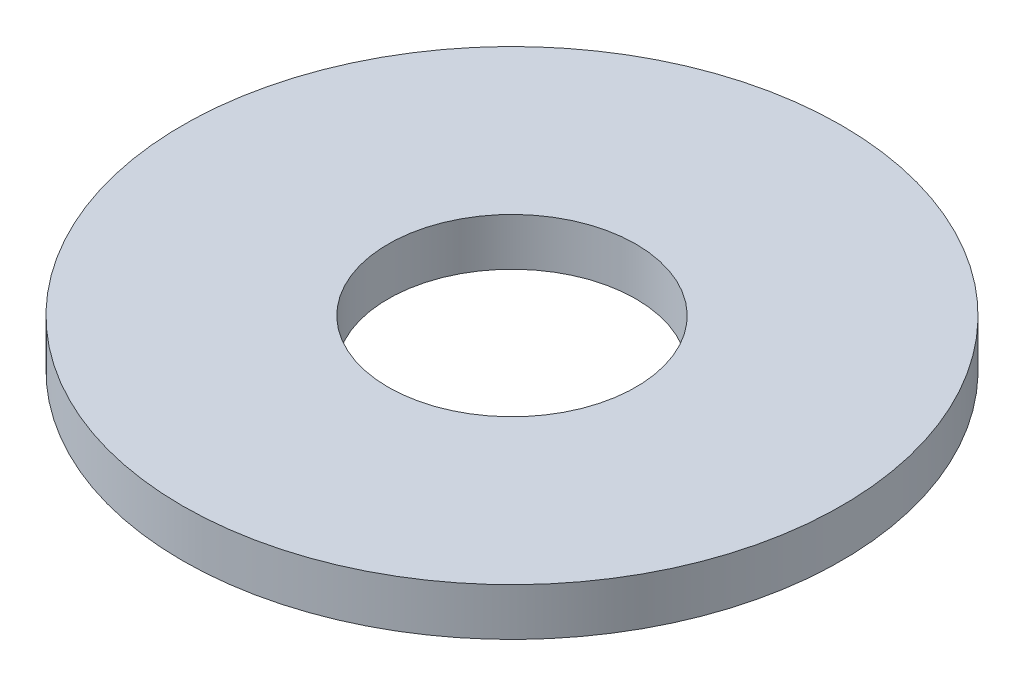
ISO-10303-21;
HEADER;
FILE_DESCRIPTION(('STEP AP214'),'2;1');
FILE_NAME('part.step','',(''),(''),'','','');
FILE_SCHEMA(('AUTOMOTIVE_DESIGN { 1 0 10303 214 1 1 1 1 }'));
ENDSEC;
DATA;
#1=APPLICATION_CONTEXT('core data for automotive mechanical design processes');
#2=APPLICATION_PROTOCOL_DEFINITION('international standard','automotive_design',2000,#1);
#3=PRODUCT_CONTEXT('',#1,'mechanical');
#4=PRODUCT('Part','Part','',(#3));
#5=PRODUCT_RELATED_PRODUCT_CATEGORY('part','',(#4));
#6=PRODUCT_DEFINITION_FORMATION('','',#4);
#7=PRODUCT_DEFINITION_CONTEXT('part definition',#1,'design');
#8=PRODUCT_DEFINITION('design','',#6,#7);
#9=PRODUCT_DEFINITION_SHAPE('','',#8);
#10=(LENGTH_UNIT() NAMED_UNIT(*) SI_UNIT(.MILLI.,.METRE.));
#11=(NAMED_UNIT(*) PLANE_ANGLE_UNIT() SI_UNIT($,.RADIAN.));
#12=(NAMED_UNIT(*) SI_UNIT($,.STERADIAN.) SOLID_ANGLE_UNIT());
#13=UNCERTAINTY_MEASURE_WITH_UNIT(LENGTH_MEASURE(1.E-05),#10,'distance_accuracy_value','');
#14=(GEOMETRIC_REPRESENTATION_CONTEXT(3) GLOBAL_UNCERTAINTY_ASSIGNED_CONTEXT((#13)) GLOBAL_UNIT_ASSIGNED_CONTEXT((#10,
#11,#12)) REPRESENTATION_CONTEXT('',''));
#15=CARTESIAN_POINT('',(0.,0.,0.));
#16=DIRECTION('',(0.,0.,1.));
#17=DIRECTION('',(1.,0.,0.));
#18=AXIS2_PLACEMENT_3D('',#15,#16,#17);
#19=CARTESIAN_POINT('',(0.,0.4572,0.));
#20=DIRECTION('',(0.,1.,0.));
#21=DIRECTION('',(0.,0.,1.));
#22=AXIS2_PLACEMENT_3D('',#19,#20,#21);
#23=PLANE('',#22);
#24=CARTESIAN_POINT('',(0.,0.4572,0.));
#25=DIRECTION('',(0.,1.,0.));
#26=DIRECTION('',(0.,0.,1.));
#27=AXIS2_PLACEMENT_3D('',#24,#25,#26);
#28=CIRCLE('',#27,1.1938);
#29=CARTESIAN_POINT('',(0.,0.4572,1.1938));
#30=VERTEX_POINT('',#29);
#31=EDGE_CURVE('E26',#30,#30,#28,.F.);
#32=ORIENTED_EDGE('',*,*,#31,.T.);
#33=EDGE_LOOP('',(#32));
#34=FACE_BOUND('',#33,.T.);
#35=CARTESIAN_POINT('',(0.,0.4572,0.));
#36=DIRECTION('',(0.,-1.,0.));
#37=DIRECTION('',(0.,0.,-1.));
#38=AXIS2_PLACEMENT_3D('',#35,#36,#37);
#39=CIRCLE('',#38,3.175);
#40=CARTESIAN_POINT('',(0.,0.4572,-3.175));
#41=VERTEX_POINT('',#40);
#42=EDGE_CURVE('E17',#41,#41,#39,.T.);
#43=ORIENTED_EDGE('',*,*,#42,.F.);
#44=EDGE_LOOP('',(#43));
#45=FACE_BOUND('',#44,.T.);
#46=ADVANCED_FACE('F14',(#34,#45),#23,.T.);
#47=CARTESIAN_POINT('',(0.,0.4572,0.));
#48=DIRECTION('',(0.,-1.,0.));
#49=DIRECTION('',(0.,0.,-1.));
#50=AXIS2_PLACEMENT_3D('',#47,#48,#49);
#51=CYLINDRICAL_SURFACE('',#50,3.175);
#52=CARTESIAN_POINT('',(0.,0.,0.));
#53=DIRECTION('',(0.,-1.,0.));
#54=DIRECTION('',(0.,0.,-1.));
#55=AXIS2_PLACEMENT_3D('',#52,#53,#54);
#56=CIRCLE('',#55,3.175);
#57=CARTESIAN_POINT('',(0.,0.,-3.175));
#58=VERTEX_POINT('',#57);
#59=EDGE_CURVE('E21',#58,#58,#56,.F.);
#60=ORIENTED_EDGE('',*,*,#59,.T.);
#61=EDGE_LOOP('',(#60));
#62=FACE_BOUND('',#61,.T.);
#63=ORIENTED_EDGE('',*,*,#42,.T.);
#64=EDGE_LOOP('',(#63));
#65=FACE_BOUND('',#64,.T.);
#66=ADVANCED_FACE('F34',(#62,#65),#51,.T.);
#67=CARTESIAN_POINT('',(0.,0.,0.));
#68=DIRECTION('',(0.,1.,0.));
#69=DIRECTION('',(0.,0.,1.));
#70=AXIS2_PLACEMENT_3D('',#67,#68,#69);
#71=CYLINDRICAL_SURFACE('',#70,1.1938);
#72=ORIENTED_EDGE('',*,*,#31,.F.);
#73=EDGE_LOOP('',(#72));
#74=FACE_BOUND('',#73,.T.);
#75=CARTESIAN_POINT('',(0.,0.,0.));
#76=DIRECTION('',(0.,1.,0.));
#77=DIRECTION('',(0.,0.,1.));
#78=AXIS2_PLACEMENT_3D('',#75,#76,#77);
#79=CIRCLE('',#78,1.1938);
#80=CARTESIAN_POINT('',(0.,0.,1.1938));
#81=VERTEX_POINT('',#80);
#82=EDGE_CURVE('E10',#81,#81,#79,.F.);
#83=ORIENTED_EDGE('',*,*,#82,.T.);
#84=EDGE_LOOP('',(#83));
#85=FACE_BOUND('',#84,.T.);
#86=ADVANCED_FACE('F41',(#74,#85),#71,.F.);
#87=CARTESIAN_POINT('',(0.,0.,0.));
#88=DIRECTION('',(0.,1.,0.));
#89=DIRECTION('',(0.,0.,1.));
#90=AXIS2_PLACEMENT_3D('',#87,#88,#89);
#91=PLANE('',#90);
#92=ORIENTED_EDGE('',*,*,#82,.F.);
#93=EDGE_LOOP('',(#92));
#94=FACE_BOUND('',#93,.T.);
#95=ORIENTED_EDGE('',*,*,#59,.F.);
#96=EDGE_LOOP('',(#95));
#97=FACE_BOUND('',#96,.T.);
#98=ADVANCED_FACE('F43',(#94,#97),#91,.F.);
#99=CLOSED_SHELL('',(#46,#66,#86,#98));
#100=MANIFOLD_SOLID_BREP('B1',#99);
#101=ADVANCED_BREP_SHAPE_REPRESENTATION('',(#18,#100),#14);
#102=SHAPE_DEFINITION_REPRESENTATION(#9,#101);
ENDSEC;
END-ISO-10303-21;
